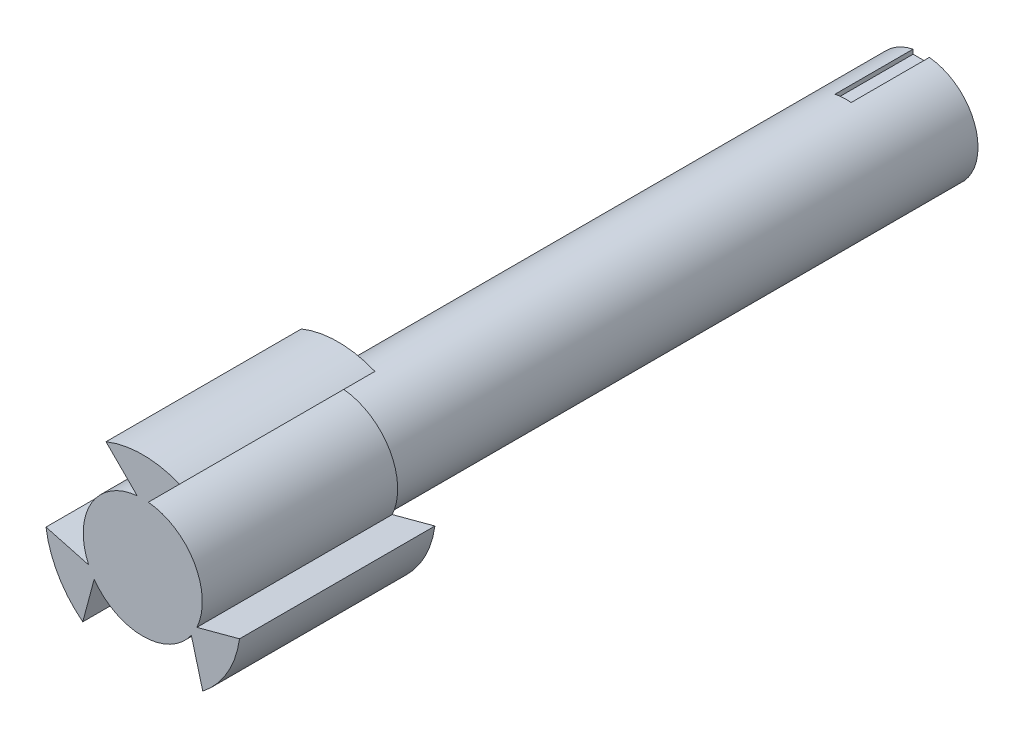
ISO-10303-21;
HEADER;
FILE_DESCRIPTION(('STEP AP214'),'2;1');
FILE_NAME('part.step','',(''),(''),'','','');
FILE_SCHEMA(('AUTOMOTIVE_DESIGN { 1 0 10303 214 1 1 1 1 }'));
ENDSEC;
DATA;
#1=APPLICATION_CONTEXT('core data for automotive mechanical design processes');
#2=APPLICATION_PROTOCOL_DEFINITION('international standard','automotive_design',2000,#1);
#3=PRODUCT_CONTEXT('',#1,'mechanical');
#4=PRODUCT('Part','Part','',(#3));
#5=PRODUCT_RELATED_PRODUCT_CATEGORY('part','',(#4));
#6=PRODUCT_DEFINITION_FORMATION('','',#4);
#7=PRODUCT_DEFINITION_CONTEXT('part definition',#1,'design');
#8=PRODUCT_DEFINITION('design','',#6,#7);
#9=PRODUCT_DEFINITION_SHAPE('','',#8);
#10=(LENGTH_UNIT() NAMED_UNIT(*) SI_UNIT(.MILLI.,.METRE.));
#11=(NAMED_UNIT(*) PLANE_ANGLE_UNIT() SI_UNIT($,.RADIAN.));
#12=(NAMED_UNIT(*) SI_UNIT($,.STERADIAN.) SOLID_ANGLE_UNIT());
#13=UNCERTAINTY_MEASURE_WITH_UNIT(LENGTH_MEASURE(1.E-05),#10,'distance_accuracy_value','');
#14=(GEOMETRIC_REPRESENTATION_CONTEXT(3) GLOBAL_UNCERTAINTY_ASSIGNED_CONTEXT((#13)) GLOBAL_UNIT_ASSIGNED_CONTEXT((#10,
#11,#12)) REPRESENTATION_CONTEXT('',''));
#15=CARTESIAN_POINT('',(0.,0.,0.));
#16=DIRECTION('',(0.,0.,1.));
#17=DIRECTION('',(1.,0.,0.));
#18=AXIS2_PLACEMENT_3D('',#15,#16,#17);
#19=CARTESIAN_POINT('',(0.00121456780055108,-0.0218943254522307,14.1668600438467));
#20=DIRECTION('',(0.,0.,-1.));
#21=DIRECTION('',(-1.,0.,0.));
#22=AXIS2_PLACEMENT_3D('',#19,#20,#21);
#23=CYLINDRICAL_SURFACE('',#22,47.);
#24=CARTESIAN_POINT('',(0.00121456780055108,-0.0218943254522307,-79.8331399561533));
#25=DIRECTION('',(0.,0.,1.));
#26=DIRECTION('',(1.,0.,0.));
#27=AXIS2_PLACEMENT_3D('',#24,#25,#26);
#28=CIRCLE('',#27,47.);
#29=CARTESIAN_POINT('',(17.6939279866693,43.5208190934171,-79.8331399561533));
#30=VERTEX_POINT('',#29);
#31=CARTESIAN_POINT('',(-17.6914988510686,43.5208190934169,-79.8331399561533));
#32=VERTEX_POINT('',#31);
#33=EDGE_CURVE('E172',#30,#32,#28,.T.);
#34=ORIENTED_EDGE('',*,*,#33,.T.);
#35=DIRECTION('',(0.,0.,-1.));
#36=VECTOR('',#35,1.);
#37=CARTESIAN_POINT('',(-17.6914988510686,43.5208190934169,14.1668600438467));
#38=LINE('',#37,#36);
#39=CARTESIAN_POINT('',(-17.6914988510686,43.5208190934169,14.1668600438467));
#40=VERTEX_POINT('',#39);
#41=EDGE_CURVE('E221',#40,#32,#38,.T.);
#42=ORIENTED_EDGE('',*,*,#41,.F.);
#43=CARTESIAN_POINT('',(0.00121456780055108,-0.0218943254522307,14.1668600438467));
#44=DIRECTION('',(0.,0.,1.));
#45=DIRECTION('',(1.,0.,0.));
#46=AXIS2_PLACEMENT_3D('',#43,#44,#45);
#47=CIRCLE('',#46,47.);
#48=CARTESIAN_POINT('',(17.6939279866693,43.5208190934171,14.1668600438467));
#49=VERTEX_POINT('',#48);
#50=EDGE_CURVE('E114',#49,#40,#47,.T.);
#51=ORIENTED_EDGE('',*,*,#50,.F.);
#52=DIRECTION('',(0.,0.,-1.));
#53=VECTOR('',#52,1.);
#54=CARTESIAN_POINT('',(17.6939279866693,43.5208190934171,14.1668600438467));
#55=LINE('',#54,#53);
#56=EDGE_CURVE('E171',#49,#30,#55,.T.);
#57=ORIENTED_EDGE('',*,*,#56,.T.);
#58=EDGE_LOOP('',(#34,#42,#51,#57));
#59=FACE_BOUND('',#58,.T.);
#60=ADVANCED_FACE('F40',(#59),#23,.T.);
#61=CARTESIAN_POINT('',(12.9262145678006,12.9031056745478,14.1668600438467));
#62=DIRECTION('',(-0.707106781186546,-0.707106781186549,0.));
#63=DIRECTION('',(0.707106781186549,-0.707106781186546,0.));
#64=AXIS2_PLACEMENT_3D('',#61,#62,#63);
#65=PLANE('',#64);
#66=DIRECTION('',(-0.707106781186549,0.707106781186546,0.));
#67=VECTOR('',#66,1.);
#68=CARTESIAN_POINT('',(12.9262145678006,12.9031056745478,-79.8331399561533));
#69=LINE('',#68,#67);
#70=CARTESIAN_POINT('',(-2.66751462814138,28.4968348704897,-79.8331399561533));
#71=VERTEX_POINT('',#70);
#72=EDGE_CURVE('E175',#71,#32,#69,.T.);
#73=ORIENTED_EDGE('',*,*,#72,.F.);
#74=DIRECTION('',(0.,0.,-1.));
#75=VECTOR('',#74,1.);
#76=CARTESIAN_POINT('',(-2.66751462814138,28.4968348704897,14.1668600438467));
#77=LINE('',#76,#75);
#78=CARTESIAN_POINT('',(-2.66751462814138,28.4968348704897,14.1668600438467));
#79=VERTEX_POINT('',#78);
#80=EDGE_CURVE('E219',#79,#71,#77,.T.);
#81=ORIENTED_EDGE('',*,*,#80,.F.);
#82=DIRECTION('',(-0.707106781186549,0.707106781186546,0.));
#83=VECTOR('',#82,1.);
#84=CARTESIAN_POINT('',(12.9262145678006,12.9031056745478,14.1668600438467));
#85=LINE('',#84,#83);
#86=EDGE_CURVE('E252',#79,#40,#85,.T.);
#87=ORIENTED_EDGE('',*,*,#86,.T.);
#88=ORIENTED_EDGE('',*,*,#41,.T.);
#89=EDGE_LOOP('',(#73,#81,#87,#88));
#90=FACE_BOUND('',#89,.T.);
#91=ADVANCED_FACE('F283',(#90),#65,.T.);
#92=CARTESIAN_POINT('',(0.00121456780055108,-0.0218943254522307,14.1668600438467));
#93=DIRECTION('',(0.,0.,-1.));
#94=DIRECTION('',(-1.,0.,0.));
#95=AXIS2_PLACEMENT_3D('',#92,#93,#94);
#96=CYLINDRICAL_SURFACE('',#95,28.6433243614062);
#97=CARTESIAN_POINT('',(0.00121456780055108,-0.0218943254522307,-79.8331399561533));
#98=DIRECTION('',(0.,0.,1.));
#99=DIRECTION('',(1.,0.,0.));
#100=AXIS2_PLACEMENT_3D('',#97,#98,#99);
#101=CIRCLE('',#100,28.6433243614062);
#102=CARTESIAN_POINT('',(-26.0310939975045,-11.9700716439162,-79.8331399561533));
#103=VERTEX_POINT('',#102);
#104=EDGE_CURVE('E179',#71,#103,#101,.T.);
#105=ORIENTED_EDGE('',*,*,#104,.T.);
#106=DIRECTION('',(0.,0.,-1.));
#107=VECTOR('',#106,1.);
#108=CARTESIAN_POINT('',(-26.0310939975045,-11.9700716439162,14.1668600438467));
#109=LINE('',#108,#107);
#110=CARTESIAN_POINT('',(-26.0310939975045,-11.9700716439162,14.1668600438467));
#111=VERTEX_POINT('',#110);
#112=EDGE_CURVE('E216',#111,#103,#109,.T.);
#113=ORIENTED_EDGE('',*,*,#112,.F.);
#114=CARTESIAN_POINT('',(0.00121456780055108,-0.0218943254522307,14.1668600438467));
#115=DIRECTION('',(0.,0.,1.));
#116=DIRECTION('',(1.,0.,0.));
#117=AXIS2_PLACEMENT_3D('',#114,#115,#116);
#118=CIRCLE('',#117,28.6433243614062);
#119=EDGE_CURVE('E255',#79,#111,#118,.T.);
#120=ORIENTED_EDGE('',*,*,#119,.F.);
#121=ORIENTED_EDGE('',*,*,#80,.T.);
#122=EDGE_LOOP('',(#105,#113,#120,#121));
#123=FACE_BOUND('',#122,.T.);
#124=ADVANCED_FACE('F289',(#123),#96,.T.);
#125=CARTESIAN_POINT('',(-4.72966377611352,-17.6777726693661,14.1668600438467));
#126=DIRECTION('',(-0.258819045102531,-0.965925826289065,0.));
#127=DIRECTION('',(0.965925826289066,-0.258819045102531,0.));
#128=AXIS2_PLACEMENT_3D('',#125,#126,#127);
#129=PLANE('',#128);
#130=DIRECTION('',(-0.965925826289066,0.258819045102531,0.));
#131=VECTOR('',#130,1.);
#132=CARTESIAN_POINT('',(-4.72966377611352,-17.6777726693661,-79.8331399561533));
#133=LINE('',#132,#131);
#134=CARTESIAN_POINT('',(-46.5542381120803,-6.47091175226782,-79.8331399561533));
#135=VERTEX_POINT('',#134);
#136=EDGE_CURVE('E181',#103,#135,#133,.T.);
#137=ORIENTED_EDGE('',*,*,#136,.T.);
#138=DIRECTION('',(0.,0.,-1.));
#139=VECTOR('',#138,1.);
#140=CARTESIAN_POINT('',(-46.5542381120803,-6.47091175226782,14.1668600438467));
#141=LINE('',#140,#139);
#142=CARTESIAN_POINT('',(-46.5542381120803,-6.47091175226782,14.1668600438467));
#143=VERTEX_POINT('',#142);
#144=EDGE_CURVE('E213',#143,#135,#141,.T.);
#145=ORIENTED_EDGE('',*,*,#144,.F.);
#146=DIRECTION('',(-0.965925826289066,0.258819045102531,0.));
#147=VECTOR('',#146,1.);
#148=CARTESIAN_POINT('',(-4.72966377611352,-17.6777726693661,14.1668600438467));
#149=LINE('',#148,#147);
#150=EDGE_CURVE('E257',#111,#143,#149,.T.);
#151=ORIENTED_EDGE('',*,*,#150,.F.);
#152=ORIENTED_EDGE('',*,*,#112,.T.);
#153=EDGE_LOOP('',(#137,#145,#151,#152));
#154=FACE_BOUND('',#153,.T.);
#155=ADVANCED_FACE('F293',(#154),#129,.F.);
#156=CARTESIAN_POINT('',(0.00121456780055108,-0.0218943254522307,14.1668600438467));
#157=DIRECTION('',(0.,0.,-1.));
#158=DIRECTION('',(-1.,0.,0.));
#159=AXIS2_PLACEMENT_3D('',#156,#157,#158);
#160=CYLINDRICAL_SURFACE('',#159,47.);
#161=CARTESIAN_POINT('',(0.00121456780055108,-0.0218943254522307,-79.8331399561533));
#162=DIRECTION('',(0.,0.,1.));
#163=DIRECTION('',(1.,0.,0.));
#164=AXIS2_PLACEMENT_3D('',#161,#162,#163);
#165=CIRCLE('',#164,47.);
#166=CARTESIAN_POINT('',(-28.8615246932114,-37.1155903175051,-79.8331399561533));
#167=VERTEX_POINT('',#166);
#168=EDGE_CURVE('E183',#135,#167,#165,.T.);
#169=ORIENTED_EDGE('',*,*,#168,.T.);
#170=DIRECTION('',(0.,0.,-1.));
#171=VECTOR('',#170,1.);
#172=CARTESIAN_POINT('',(-28.8615246932114,-37.1155903175051,14.1668600438467));
#173=LINE('',#172,#171);
#174=CARTESIAN_POINT('',(-28.8615246932114,-37.1155903175051,14.1668600438467));
#175=VERTEX_POINT('',#174);
#176=EDGE_CURVE('E211',#175,#167,#173,.T.);
#177=ORIENTED_EDGE('',*,*,#176,.F.);
#178=CARTESIAN_POINT('',(0.00121456780055108,-0.0218943254522307,14.1668600438467));
#179=DIRECTION('',(0.,0.,1.));
#180=DIRECTION('',(1.,0.,0.));
#181=AXIS2_PLACEMENT_3D('',#178,#179,#180);
#182=CIRCLE('',#181,47.);
#183=EDGE_CURVE('E259',#143,#175,#182,.T.);
#184=ORIENTED_EDGE('',*,*,#183,.F.);
#185=ORIENTED_EDGE('',*,*,#144,.T.);
#186=EDGE_LOOP('',(#169,#177,#184,#185));
#187=FACE_BOUND('',#186,.T.);
#188=ADVANCED_FACE('F298',(#187),#160,.T.);
#189=CARTESIAN_POINT('',(-17.6546637761133,4.70898401846178,14.1668600438467));
#190=DIRECTION('',(0.965925826289066,-0.258819045102528,0.));
#191=DIRECTION('',(0.258819045102528,0.965925826289066,0.));
#192=AXIS2_PLACEMENT_3D('',#189,#190,#191);
#193=PLANE('',#192);
#194=DIRECTION('',(-0.258819045102528,-0.965925826289066,0.));
#195=VECTOR('',#194,1.);
#196=CARTESIAN_POINT('',(-17.6546637761133,4.70898401846178,-79.8331399561533));
#197=LINE('',#196,#195);
#198=CARTESIAN_POINT('',(-23.3623648015631,-16.5924462029292,-79.8331399561533));
#199=VERTEX_POINT('',#198);
#200=EDGE_CURVE('E186',#199,#167,#197,.T.);
#201=ORIENTED_EDGE('',*,*,#200,.F.);
#202=DIRECTION('',(0.,0.,-1.));
#203=VECTOR('',#202,1.);
#204=CARTESIAN_POINT('',(-23.3623648015631,-16.5924462029292,14.1668600438467));
#205=LINE('',#204,#203);
#206=CARTESIAN_POINT('',(-23.3623648015631,-16.5924462029292,14.1668600438467));
#207=VERTEX_POINT('',#206);
#208=EDGE_CURVE('E209',#207,#199,#205,.T.);
#209=ORIENTED_EDGE('',*,*,#208,.F.);
#210=DIRECTION('',(-0.258819045102528,-0.965925826289066,0.));
#211=VECTOR('',#210,1.);
#212=CARTESIAN_POINT('',(-17.6546637761133,4.70898401846178,14.1668600438467));
#213=LINE('',#212,#211);
#214=EDGE_CURVE('E261',#207,#175,#213,.T.);
#215=ORIENTED_EDGE('',*,*,#214,.T.);
#216=ORIENTED_EDGE('',*,*,#176,.T.);
#217=EDGE_LOOP('',(#201,#209,#215,#216));
#218=FACE_BOUND('',#217,.T.);
#219=ADVANCED_FACE('F301',(#218),#193,.T.);
#220=CARTESIAN_POINT('',(0.00121456780055108,-0.0218943254522307,14.1668600438467));
#221=DIRECTION('',(0.,0.,-1.));
#222=DIRECTION('',(-1.,0.,0.));
#223=AXIS2_PLACEMENT_3D('',#220,#221,#222);
#224=CYLINDRICAL_SURFACE('',#223,28.643324361406);
#225=CARTESIAN_POINT('',(0.00121456780055108,-0.0218943254522307,-79.8331399561533));
#226=DIRECTION('',(0.,0.,1.));
#227=DIRECTION('',(1.,0.,0.));
#228=AXIS2_PLACEMENT_3D('',#225,#226,#227);
#229=CIRCLE('',#228,28.643324361406);
#230=CARTESIAN_POINT('',(23.364793937164,-16.5924462029295,-79.8331399561533));
#231=VERTEX_POINT('',#230);
#232=EDGE_CURVE('E189',#199,#231,#229,.T.);
#233=ORIENTED_EDGE('',*,*,#232,.T.);
#234=DIRECTION('',(0.,0.,-1.));
#235=VECTOR('',#234,1.);
#236=CARTESIAN_POINT('',(23.364793937164,-16.5924462029295,14.1668600438467));
#237=LINE('',#236,#235);
#238=CARTESIAN_POINT('',(23.364793937164,-16.5924462029295,14.1668600438467));
#239=VERTEX_POINT('',#238);
#240=EDGE_CURVE('E206',#239,#231,#237,.T.);
#241=ORIENTED_EDGE('',*,*,#240,.F.);
#242=CARTESIAN_POINT('',(0.00121456780055108,-0.0218943254522307,14.1668600438467));
#243=DIRECTION('',(0.,0.,1.));
#244=DIRECTION('',(1.,0.,0.));
#245=AXIS2_PLACEMENT_3D('',#242,#243,#244);
#246=CIRCLE('',#245,28.643324361406);
#247=EDGE_CURVE('E264',#207,#239,#246,.T.);
#248=ORIENTED_EDGE('',*,*,#247,.F.);
#249=ORIENTED_EDGE('',*,*,#208,.T.);
#250=EDGE_LOOP('',(#233,#241,#248,#249));
#251=FACE_BOUND('',#250,.T.);
#252=ADVANCED_FACE('F304',(#251),#224,.T.);
#253=CARTESIAN_POINT('',(17.6570929117145,4.70898401846154,14.1668600438467));
#254=DIRECTION('',(0.96592582628907,0.258819045102515,0.));
#255=DIRECTION('',(-0.258819045102515,0.96592582628907,0.));
#256=AXIS2_PLACEMENT_3D('',#253,#254,#255);
#257=PLANE('',#256);
#258=DIRECTION('',(0.258819045102515,-0.96592582628907,0.));
#259=VECTOR('',#258,1.);
#260=CARTESIAN_POINT('',(17.6570929117145,4.70898401846154,-79.8331399561533));
#261=LINE('',#260,#259);
#262=CARTESIAN_POINT('',(28.863953828812,-37.1155903175055,-79.8331399561533));
#263=VERTEX_POINT('',#262);
#264=EDGE_CURVE('E191',#231,#263,#261,.T.);
#265=ORIENTED_EDGE('',*,*,#264,.T.);
#266=DIRECTION('',(0.,0.,-1.));
#267=VECTOR('',#266,1.);
#268=CARTESIAN_POINT('',(28.863953828812,-37.1155903175055,14.1668600438467));
#269=LINE('',#268,#267);
#270=CARTESIAN_POINT('',(28.863953828812,-37.1155903175055,14.1668600438467));
#271=VERTEX_POINT('',#270);
#272=EDGE_CURVE('E203',#271,#263,#269,.T.);
#273=ORIENTED_EDGE('',*,*,#272,.F.);
#274=DIRECTION('',(0.258819045102515,-0.96592582628907,0.));
#275=VECTOR('',#274,1.);
#276=CARTESIAN_POINT('',(17.6570929117145,4.70898401846154,14.1668600438467));
#277=LINE('',#276,#275);
#278=EDGE_CURVE('E166',#239,#271,#277,.T.);
#279=ORIENTED_EDGE('',*,*,#278,.F.);
#280=ORIENTED_EDGE('',*,*,#240,.T.);
#281=EDGE_LOOP('',(#265,#273,#279,#280));
#282=FACE_BOUND('',#281,.T.);
#283=ADVANCED_FACE('F271',(#282),#257,.F.);
#284=CARTESIAN_POINT('',(0.00121456780055108,-0.0218943254522307,14.1668600438467));
#285=DIRECTION('',(0.,0.,-1.));
#286=DIRECTION('',(-1.,0.,0.));
#287=AXIS2_PLACEMENT_3D('',#284,#285,#286);
#288=CYLINDRICAL_SURFACE('',#287,47.);
#289=CARTESIAN_POINT('',(0.00121456780055108,-0.0218943254522307,-79.8331399561533));
#290=DIRECTION('',(0.,0.,1.));
#291=DIRECTION('',(1.,0.,0.));
#292=AXIS2_PLACEMENT_3D('',#289,#290,#291);
#293=CIRCLE('',#292,47.);
#294=CARTESIAN_POINT('',(46.5566672476814,-6.47091175226846,-79.8331399561533));
#295=VERTEX_POINT('',#294);
#296=EDGE_CURVE('E193',#263,#295,#293,.T.);
#297=ORIENTED_EDGE('',*,*,#296,.T.);
#298=DIRECTION('',(0.,0.,-1.));
#299=VECTOR('',#298,1.);
#300=CARTESIAN_POINT('',(46.5566672476814,-6.47091175226846,14.1668600438467));
#301=LINE('',#300,#299);
#302=CARTESIAN_POINT('',(46.5566672476814,-6.47091175226846,14.1668600438467));
#303=VERTEX_POINT('',#302);
#304=EDGE_CURVE('E154',#303,#295,#301,.T.);
#305=ORIENTED_EDGE('',*,*,#304,.F.);
#306=CARTESIAN_POINT('',(0.00121456780055108,-0.0218943254522307,14.1668600438467));
#307=DIRECTION('',(0.,0.,1.));
#308=DIRECTION('',(1.,0.,0.));
#309=AXIS2_PLACEMENT_3D('',#306,#307,#308);
#310=CIRCLE('',#309,47.);
#311=EDGE_CURVE('E163',#271,#303,#310,.T.);
#312=ORIENTED_EDGE('',*,*,#311,.F.);
#313=ORIENTED_EDGE('',*,*,#272,.T.);
#314=EDGE_LOOP('',(#297,#305,#312,#313));
#315=FACE_BOUND('',#314,.T.);
#316=ADVANCED_FACE('F275',(#315),#288,.T.);
#317=CARTESIAN_POINT('',(4.73209291171438,-17.6777726693661,14.1668600438467));
#318=DIRECTION('',(-0.258819045102518,0.965925826289069,0.));
#319=DIRECTION('',(-0.965925826289069,-0.258819045102518,0.));
#320=AXIS2_PLACEMENT_3D('',#317,#318,#319);
#321=PLANE('',#320);
#322=DIRECTION('',(0.965925826289069,0.258819045102518,0.));
#323=VECTOR('',#322,1.);
#324=CARTESIAN_POINT('',(4.73209291171438,-17.6777726693661,-79.8331399561533));
#325=LINE('',#324,#323);
#326=CARTESIAN_POINT('',(26.0335231331054,-11.9700716439166,-79.8331399561533));
#327=VERTEX_POINT('',#326);
#328=EDGE_CURVE('E151',#327,#295,#325,.T.);
#329=ORIENTED_EDGE('',*,*,#328,.F.);
#330=DIRECTION('',(0.,0.,-1.));
#331=VECTOR('',#330,1.);
#332=CARTESIAN_POINT('',(26.0335231331054,-11.9700716439166,14.1668600438467));
#333=LINE('',#332,#331);
#334=CARTESIAN_POINT('',(26.0335231331054,-11.9700716439166,14.1668600438467));
#335=VERTEX_POINT('',#334);
#336=EDGE_CURVE('E145',#335,#327,#333,.T.);
#337=ORIENTED_EDGE('',*,*,#336,.F.);
#338=DIRECTION('',(0.965925826289069,0.258819045102518,0.));
#339=VECTOR('',#338,1.);
#340=CARTESIAN_POINT('',(4.73209291171438,-17.6777726693661,14.1668600438467));
#341=LINE('',#340,#339);
#342=EDGE_CURVE('E149',#335,#303,#341,.T.);
#343=ORIENTED_EDGE('',*,*,#342,.T.);
#344=ORIENTED_EDGE('',*,*,#304,.T.);
#345=EDGE_LOOP('',(#329,#337,#343,#344));
#346=FACE_BOUND('',#345,.T.);
#347=ADVANCED_FACE('F147',(#346),#321,.T.);
#348=CARTESIAN_POINT('',(0.00121456780055108,-0.0218943254522307,14.1668600438467));
#349=DIRECTION('',(0.,0.,-1.));
#350=DIRECTION('',(-1.,0.,0.));
#351=AXIS2_PLACEMENT_3D('',#348,#349,#350);
#352=CYLINDRICAL_SURFACE('',#351,28.6433243614062);
#353=CARTESIAN_POINT('',(0.00121456780055108,-0.0218943254522307,-79.8331399561533));
#354=DIRECTION('',(0.,0.,1.));
#355=DIRECTION('',(1.,0.,0.));
#356=AXIS2_PLACEMENT_3D('',#353,#354,#355);
#357=CIRCLE('',#356,28.6433243614062);
#358=CARTESIAN_POINT('',(2.66994376374192,28.4968348704897,-79.8331399561533));
#359=VERTEX_POINT('',#358);
#360=EDGE_CURVE('E197',#327,#359,#357,.T.);
#361=ORIENTED_EDGE('',*,*,#360,.T.);
#362=DIRECTION('',(0.,0.,-1.));
#363=VECTOR('',#362,1.);
#364=CARTESIAN_POINT('',(2.66994376374192,28.4968348704897,14.1668600438467));
#365=LINE('',#364,#363);
#366=CARTESIAN_POINT('',(2.66994376374192,28.4968348704897,14.1668600438467));
#367=VERTEX_POINT('',#366);
#368=EDGE_CURVE('E155',#367,#359,#365,.T.);
#369=ORIENTED_EDGE('',*,*,#368,.F.);
#370=CARTESIAN_POINT('',(0.00121456780055108,-0.0218943254522307,14.1668600438467));
#371=DIRECTION('',(0.,0.,1.));
#372=DIRECTION('',(1.,0.,0.));
#373=AXIS2_PLACEMENT_3D('',#370,#371,#372);
#374=CIRCLE('',#373,28.6433243614062);
#375=EDGE_CURVE('E158',#335,#367,#374,.T.);
#376=ORIENTED_EDGE('',*,*,#375,.F.);
#377=ORIENTED_EDGE('',*,*,#336,.T.);
#378=EDGE_LOOP('',(#361,#369,#376,#377));
#379=FACE_BOUND('',#378,.T.);
#380=ADVANCED_FACE('F159',(#379),#352,.T.);
#381=CARTESIAN_POINT('',(-12.9237854321998,12.9031056745481,14.1668600438467));
#382=DIRECTION('',(-0.707106781186546,0.707106781186549,0.));
#383=DIRECTION('',(-0.707106781186549,-0.707106781186546,0.));
#384=AXIS2_PLACEMENT_3D('',#381,#382,#383);
#385=PLANE('',#384);
#386=DIRECTION('',(0.707106781186549,0.707106781186546,0.));
#387=VECTOR('',#386,1.);
#388=CARTESIAN_POINT('',(-12.9237854321998,12.9031056745481,-79.8331399561533));
#389=LINE('',#388,#387);
#390=EDGE_CURVE('E108',#359,#30,#389,.T.);
#391=ORIENTED_EDGE('',*,*,#390,.T.);
#392=ORIENTED_EDGE('',*,*,#56,.F.);
#393=DIRECTION('',(0.707106781186549,0.707106781186546,0.));
#394=VECTOR('',#393,1.);
#395=CARTESIAN_POINT('',(-12.9237854321998,12.9031056745481,14.1668600438467));
#396=LINE('',#395,#394);
#397=EDGE_CURVE('E63',#367,#49,#396,.T.);
#398=ORIENTED_EDGE('',*,*,#397,.F.);
#399=ORIENTED_EDGE('',*,*,#368,.T.);
#400=EDGE_LOOP('',(#391,#392,#398,#399));
#401=FACE_BOUND('',#400,.T.);
#402=ADVANCED_FACE('F279',(#401),#385,.F.);
#403=CARTESIAN_POINT('',(0.00121456780055108,-0.0218943254522307,14.1668600438467));
#404=DIRECTION('',(0.,0.,1.));
#405=DIRECTION('',(1.,0.,0.));
#406=AXIS2_PLACEMENT_3D('',#403,#404,#405);
#407=PLANE('',#406);
#408=ORIENTED_EDGE('',*,*,#50,.T.);
#409=ORIENTED_EDGE('',*,*,#86,.F.);
#410=ORIENTED_EDGE('',*,*,#119,.T.);
#411=ORIENTED_EDGE('',*,*,#150,.T.);
#412=ORIENTED_EDGE('',*,*,#183,.T.);
#413=ORIENTED_EDGE('',*,*,#214,.F.);
#414=ORIENTED_EDGE('',*,*,#247,.T.);
#415=ORIENTED_EDGE('',*,*,#278,.T.);
#416=ORIENTED_EDGE('',*,*,#311,.T.);
#417=ORIENTED_EDGE('',*,*,#342,.F.);
#418=ORIENTED_EDGE('',*,*,#375,.T.);
#419=ORIENTED_EDGE('',*,*,#397,.T.);
#420=EDGE_LOOP('',(#408,#409,#410,#411,#412,#413,#414,#415,#416,#417,#418,#419));
#421=FACE_BOUND('',#420,.T.);
#422=ADVANCED_FACE('F161',(#421),#407,.T.);
#423=CARTESIAN_POINT('',(0.00121456780055108,-0.0218943254522307,-79.8331399561533));
#424=DIRECTION('',(0.,0.,1.));
#425=DIRECTION('',(1.,0.,0.));
#426=AXIS2_PLACEMENT_3D('',#423,#424,#425);
#427=PLANE('',#426);
#428=CARTESIAN_POINT('',(0.00121456780055108,-0.0218943254522307,-79.8331399561533));
#429=DIRECTION('',(0.,0.,1.));
#430=DIRECTION('',(1.,0.,0.));
#431=AXIS2_PLACEMENT_3D('',#428,#429,#430);
#432=CIRCLE('',#431,25.85);
#433=CARTESIAN_POINT('',(25.8512145678006,-0.0218943254522307,-79.8331399561533));
#434=VERTEX_POINT('',#433);
#435=EDGE_CURVE('E176',#434,#434,#432,.T.);
#436=ORIENTED_EDGE('',*,*,#435,.T.);
#437=EDGE_LOOP('',(#436));
#438=FACE_BOUND('',#437,.T.);
#439=ORIENTED_EDGE('',*,*,#33,.F.);
#440=ORIENTED_EDGE('',*,*,#390,.F.);
#441=ORIENTED_EDGE('',*,*,#360,.F.);
#442=ORIENTED_EDGE('',*,*,#328,.T.);
#443=ORIENTED_EDGE('',*,*,#296,.F.);
#444=ORIENTED_EDGE('',*,*,#264,.F.);
#445=ORIENTED_EDGE('',*,*,#232,.F.);
#446=ORIENTED_EDGE('',*,*,#200,.T.);
#447=ORIENTED_EDGE('',*,*,#168,.F.);
#448=ORIENTED_EDGE('',*,*,#136,.F.);
#449=ORIENTED_EDGE('',*,*,#104,.F.);
#450=ORIENTED_EDGE('',*,*,#72,.T.);
#451=EDGE_LOOP('',(#439,#440,#441,#442,#443,#444,#445,#446,#447,#448,#449,#450));
#452=FACE_BOUND('',#451,.T.);
#453=ADVANCED_FACE('F278',(#438,#452),#427,.F.);
#454=CARTESIAN_POINT('',(0.00121456780055108,-0.0218943254522307,-361.833139956153));
#455=DIRECTION('',(0.,0.,1.));
#456=DIRECTION('',(1.,0.,0.));
#457=AXIS2_PLACEMENT_3D('',#454,#455,#456);
#458=CYLINDRICAL_SURFACE('',#457,25.85);
#459=DIRECTION('',(0.,0.,1.));
#460=VECTOR('',#459,1.);
#461=CARTESIAN_POINT('',(2.43509029728278,25.7132712837572,-361.833139956153));
#462=LINE('',#461,#460);
#463=CARTESIAN_POINT('',(2.43509029728277,25.7132712837572,-324.233139956153));
#464=VERTEX_POINT('',#463);
#465=CARTESIAN_POINT('',(2.43509029728278,25.7132712837572,-361.833139956153));
#466=VERTEX_POINT('',#465);
#467=EDGE_CURVE('E244',#464,#466,#462,.F.);
#468=ORIENTED_EDGE('',*,*,#467,.F.);
#469=CARTESIAN_POINT('',(0.00121456780055108,-0.0218943254522307,-324.233139956153));
#470=DIRECTION('',(0.,0.,-1.));
#471=DIRECTION('',(-1.,0.,0.));
#472=AXIS2_PLACEMENT_3D('',#469,#470,#471);
#473=CIRCLE('',#472,25.85);
#474=CARTESIAN_POINT('',(-5.37235090230462,25.2634234328535,-324.233139956153));
#475=VERTEX_POINT('',#474);
#476=EDGE_CURVE('E11',#464,#475,#473,.F.);
#477=ORIENTED_EDGE('',*,*,#476,.T.);
#478=DIRECTION('',(0.,0.,1.));
#479=VECTOR('',#478,1.);
#480=CARTESIAN_POINT('',(-5.37235090230463,25.2634234328535,-361.833139956153));
#481=LINE('',#480,#479);
#482=CARTESIAN_POINT('',(-5.37235090230463,25.2634234328535,-361.833139956153));
#483=VERTEX_POINT('',#482);
#484=EDGE_CURVE('E246',#483,#475,#481,.T.);
#485=ORIENTED_EDGE('',*,*,#484,.F.);
#486=CARTESIAN_POINT('',(0.00121456780055108,-0.0218943254522307,-361.833139956153));
#487=DIRECTION('',(0.,0.,1.));
#488=DIRECTION('',(1.,0.,0.));
#489=AXIS2_PLACEMENT_3D('',#486,#487,#488);
#490=CIRCLE('',#489,25.85);
#491=EDGE_CURVE('E224',#483,#466,#490,.T.);
#492=ORIENTED_EDGE('',*,*,#491,.T.);
#493=EDGE_LOOP('',(#468,#477,#485,#492));
#494=FACE_BOUND('',#493,.T.);
#495=ORIENTED_EDGE('',*,*,#435,.F.);
#496=EDGE_LOOP('',(#495));
#497=FACE_BOUND('',#496,.T.);
#498=ADVANCED_FACE('F242',(#494,#497),#458,.T.);
#499=CARTESIAN_POINT('',(0.00121456780055108,-0.0218943254522307,-361.833139956153));
#500=DIRECTION('',(0.,0.,1.));
#501=DIRECTION('',(1.,0.,0.));
#502=AXIS2_PLACEMENT_3D('',#499,#500,#501);
#503=PLANE('',#502);
#504=DIRECTION('',(-1.,0.,0.));
#505=VECTOR('',#504,1.);
#506=CARTESIAN_POINT('',(2.43509029728278,23.1354905078797,-361.833139956153));
#507=LINE('',#506,#505);
#508=CARTESIAN_POINT('',(2.43509029728278,23.1354905078797,-361.833139956153));
#509=VERTEX_POINT('',#508);
#510=CARTESIAN_POINT('',(-5.37235090230463,23.1354905078797,-361.833139956153));
#511=VERTEX_POINT('',#510);
#512=EDGE_CURVE('E54',#509,#511,#507,.T.);
#513=ORIENTED_EDGE('',*,*,#512,.F.);
#514=DIRECTION('',(0.,1.,0.));
#515=VECTOR('',#514,1.);
#516=CARTESIAN_POINT('',(2.43509029728278,-0.0218943254522307,-361.833139956153));
#517=LINE('',#516,#515);
#518=EDGE_CURVE('E47',#509,#466,#517,.T.);
#519=ORIENTED_EDGE('',*,*,#518,.T.);
#520=ORIENTED_EDGE('',*,*,#491,.F.);
#521=DIRECTION('',(0.,1.,0.));
#522=VECTOR('',#521,1.);
#523=CARTESIAN_POINT('',(-5.37235090230463,23.1354905078797,-361.833139956153));
#524=LINE('',#523,#522);
#525=EDGE_CURVE('E487',#511,#483,#524,.T.);
#526=ORIENTED_EDGE('',*,*,#525,.F.);
#527=EDGE_LOOP('',(#513,#519,#520,#526));
#528=FACE_BOUND('',#527,.T.);
#529=ADVANCED_FACE('F231',(#528),#503,.F.);
#530=CARTESIAN_POINT('',(2.43509029728278,23.1354905078797,-324.233139956153));
#531=DIRECTION('',(0.,-1.,0.));
#532=DIRECTION('',(0.,0.,-1.));
#533=AXIS2_PLACEMENT_3D('',#530,#531,#532);
#534=PLANE('',#533);
#535=ORIENTED_EDGE('',*,*,#512,.T.);
#536=DIRECTION('',(0.,0.,-1.));
#537=VECTOR('',#536,1.);
#538=CARTESIAN_POINT('',(-5.37235090230463,23.1354905078797,-324.233139956153));
#539=LINE('',#538,#537);
#540=CARTESIAN_POINT('',(-5.37235090230463,23.1354905078797,-324.233139956153));
#541=VERTEX_POINT('',#540);
#542=EDGE_CURVE('E481',#541,#511,#539,.T.);
#543=ORIENTED_EDGE('',*,*,#542,.F.);
#544=DIRECTION('',(-1.,0.,0.));
#545=VECTOR('',#544,1.);
#546=CARTESIAN_POINT('',(2.43509029728278,23.1354905078797,-324.233139956153));
#547=LINE('',#546,#545);
#548=CARTESIAN_POINT('',(2.43509029728278,23.1354905078797,-324.233139956153));
#549=VERTEX_POINT('',#548);
#550=EDGE_CURVE('E479',#549,#541,#547,.T.);
#551=ORIENTED_EDGE('',*,*,#550,.F.);
#552=DIRECTION('',(0.,0.,-1.));
#553=VECTOR('',#552,1.);
#554=CARTESIAN_POINT('',(2.43509029728278,23.1354905078797,-324.233139956153));
#555=LINE('',#554,#553);
#556=EDGE_CURVE('E484',#549,#509,#555,.T.);
#557=ORIENTED_EDGE('',*,*,#556,.T.);
#558=EDGE_LOOP('',(#535,#543,#551,#557));
#559=FACE_BOUND('',#558,.T.);
#560=ADVANCED_FACE('F421',(#559),#534,.F.);
#561=CARTESIAN_POINT('',(2.43509029728278,23.1354905078797,-324.233139956153));
#562=DIRECTION('',(1.,0.,0.));
#563=DIRECTION('',(0.,0.,-1.));
#564=AXIS2_PLACEMENT_3D('',#561,#562,#563);
#565=PLANE('',#564);
#566=ORIENTED_EDGE('',*,*,#467,.T.);
#567=ORIENTED_EDGE('',*,*,#518,.F.);
#568=ORIENTED_EDGE('',*,*,#556,.F.);
#569=DIRECTION('',(0.,-1.,0.));
#570=VECTOR('',#569,1.);
#571=CARTESIAN_POINT('',(2.43509029728278,23.1354905078797,-324.233139956153));
#572=LINE('',#571,#570);
#573=EDGE_CURVE('E475',#464,#549,#572,.T.);
#574=ORIENTED_EDGE('',*,*,#573,.F.);
#575=EDGE_LOOP('',(#566,#567,#568,#574));
#576=FACE_BOUND('',#575,.T.);
#577=ADVANCED_FACE('F429',(#576),#565,.F.);
#578=CARTESIAN_POINT('',(-5.37235090230463,23.1354905078797,-324.233139956153));
#579=DIRECTION('',(-1.,0.,0.));
#580=DIRECTION('',(0.,0.,1.));
#581=AXIS2_PLACEMENT_3D('',#578,#579,#580);
#582=PLANE('',#581);
#583=ORIENTED_EDGE('',*,*,#484,.T.);
#584=DIRECTION('',(0.,1.,0.));
#585=VECTOR('',#584,1.);
#586=CARTESIAN_POINT('',(-5.37235090230463,23.1354905078797,-324.233139956153));
#587=LINE('',#586,#585);
#588=EDGE_CURVE('E482',#541,#475,#587,.T.);
#589=ORIENTED_EDGE('',*,*,#588,.F.);
#590=ORIENTED_EDGE('',*,*,#542,.T.);
#591=ORIENTED_EDGE('',*,*,#525,.T.);
#592=EDGE_LOOP('',(#583,#589,#590,#591));
#593=FACE_BOUND('',#592,.T.);
#594=ADVANCED_FACE('F437',(#593),#582,.F.);
#595=CARTESIAN_POINT('',(0.00121456780055108,-0.0218943254522307,-324.233139956153));
#596=DIRECTION('',(0.,0.,-1.));
#597=DIRECTION('',(-1.,0.,0.));
#598=AXIS2_PLACEMENT_3D('',#595,#596,#597);
#599=PLANE('',#598);
#600=ORIENTED_EDGE('',*,*,#573,.T.);
#601=ORIENTED_EDGE('',*,*,#550,.T.);
#602=ORIENTED_EDGE('',*,*,#588,.T.);
#603=ORIENTED_EDGE('',*,*,#476,.F.);
#604=EDGE_LOOP('',(#600,#601,#602,#603));
#605=FACE_BOUND('',#604,.T.);
#606=ADVANCED_FACE('F445',(#605),#599,.T.);
#607=CLOSED_SHELL('',(#60,#91,#124,#155,#188,#219,#252,#283,#316,#347,#380,#402,#422,#453,#498,
#529,#560,#577,#594,#606));
#608=MANIFOLD_SOLID_BREP('B2',#607);
#609=ADVANCED_BREP_SHAPE_REPRESENTATION('',(#18,#608),#14);
#610=SHAPE_DEFINITION_REPRESENTATION(#9,#609);
ENDSEC;
END-ISO-10303-21;
